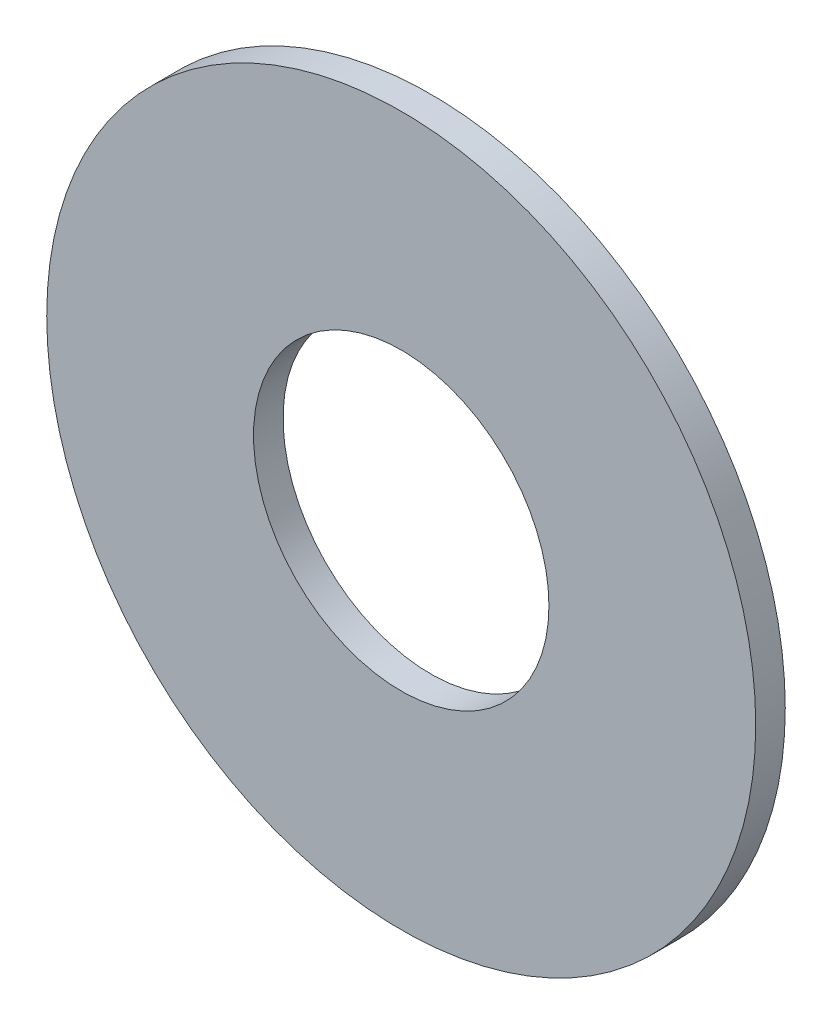
ISO-10303-21;
HEADER;
FILE_DESCRIPTION(('STEP AP214'),'2;1');
FILE_NAME('part.step','',(''),(''),'','','');
FILE_SCHEMA(('AUTOMOTIVE_DESIGN { 1 0 10303 214 1 1 1 1 }'));
ENDSEC;
DATA;
#1=APPLICATION_CONTEXT('core data for automotive mechanical design processes');
#2=APPLICATION_PROTOCOL_DEFINITION('international standard','automotive_design',2000,#1);
#3=PRODUCT_CONTEXT('',#1,'mechanical');
#4=PRODUCT('Part','Part','',(#3));
#5=PRODUCT_RELATED_PRODUCT_CATEGORY('part','',(#4));
#6=PRODUCT_DEFINITION_FORMATION('','',#4);
#7=PRODUCT_DEFINITION_CONTEXT('part definition',#1,'design');
#8=PRODUCT_DEFINITION('design','',#6,#7);
#9=PRODUCT_DEFINITION_SHAPE('','',#8);
#10=(LENGTH_UNIT() NAMED_UNIT(*) SI_UNIT(.MILLI.,.METRE.));
#11=(NAMED_UNIT(*) PLANE_ANGLE_UNIT() SI_UNIT($,.RADIAN.));
#12=(NAMED_UNIT(*) SI_UNIT($,.STERADIAN.) SOLID_ANGLE_UNIT());
#13=UNCERTAINTY_MEASURE_WITH_UNIT(LENGTH_MEASURE(1.E-05),#10,'distance_accuracy_value','');
#14=(GEOMETRIC_REPRESENTATION_CONTEXT(3) GLOBAL_UNCERTAINTY_ASSIGNED_CONTEXT((#13)) GLOBAL_UNIT_ASSIGNED_CONTEXT((#10,
#11,#12)) REPRESENTATION_CONTEXT('',''));
#15=CARTESIAN_POINT('',(0.,0.,0.));
#16=DIRECTION('',(0.,0.,1.));
#17=DIRECTION('',(1.,0.,0.));
#18=AXIS2_PLACEMENT_3D('',#15,#16,#17);
#19=CARTESIAN_POINT('',(0.,0.,0.5));
#20=DIRECTION('',(0.,0.,-1.));
#21=DIRECTION('',(-1.,0.,0.));
#22=AXIS2_PLACEMENT_3D('',#19,#20,#21);
#23=CYLINDRICAL_SURFACE('',#22,6.);
#24=CARTESIAN_POINT('',(0.,0.,0.5));
#25=DIRECTION('',(0.,0.,1.));
#26=DIRECTION('',(1.,0.,0.));
#27=AXIS2_PLACEMENT_3D('',#24,#25,#26);
#28=CIRCLE('',#27,6.);
#29=CARTESIAN_POINT('',(6.,0.,0.5));
#30=VERTEX_POINT('',#29);
#31=EDGE_CURVE('E10',#30,#30,#28,.T.);
#32=ORIENTED_EDGE('',*,*,#31,.F.);
#33=EDGE_LOOP('',(#32));
#34=FACE_BOUND('',#33,.T.);
#35=CARTESIAN_POINT('',(0.,0.,0.));
#36=DIRECTION('',(0.,0.,1.));
#37=DIRECTION('',(1.,0.,0.));
#38=AXIS2_PLACEMENT_3D('',#35,#36,#37);
#39=CIRCLE('',#38,6.);
#40=CARTESIAN_POINT('',(6.,0.,0.));
#41=VERTEX_POINT('',#40);
#42=EDGE_CURVE('E46',#41,#41,#39,.T.);
#43=ORIENTED_EDGE('',*,*,#42,.T.);
#44=EDGE_LOOP('',(#43));
#45=FACE_BOUND('',#44,.T.);
#46=ADVANCED_FACE('F43',(#34,#45),#23,.T.);
#47=CARTESIAN_POINT('',(0.,0.,0.5));
#48=DIRECTION('',(0.,0.,1.));
#49=DIRECTION('',(1.,0.,0.));
#50=AXIS2_PLACEMENT_3D('',#47,#48,#49);
#51=PLANE('',#50);
#52=CARTESIAN_POINT('',(0.,0.,0.5));
#53=DIRECTION('',(0.,0.,1.));
#54=DIRECTION('',(1.,0.,0.));
#55=AXIS2_PLACEMENT_3D('',#52,#53,#54);
#56=CIRCLE('',#55,2.5);
#57=CARTESIAN_POINT('',(2.5,0.,0.5));
#58=VERTEX_POINT('',#57);
#59=EDGE_CURVE('E57',#58,#58,#56,.T.);
#60=ORIENTED_EDGE('',*,*,#59,.F.);
#61=EDGE_LOOP('',(#60));
#62=FACE_BOUND('',#61,.T.);
#63=ORIENTED_EDGE('',*,*,#31,.T.);
#64=EDGE_LOOP('',(#63));
#65=FACE_BOUND('',#64,.T.);
#66=ADVANCED_FACE('F74',(#62,#65),#51,.T.);
#67=CARTESIAN_POINT('',(0.,0.,0.));
#68=DIRECTION('',(0.,0.,1.));
#69=DIRECTION('',(1.,0.,0.));
#70=AXIS2_PLACEMENT_3D('',#67,#68,#69);
#71=PLANE('',#70);
#72=CARTESIAN_POINT('',(0.,0.,0.));
#73=DIRECTION('',(0.,0.,1.));
#74=DIRECTION('',(1.,0.,0.));
#75=AXIS2_PLACEMENT_3D('',#72,#73,#74);
#76=CIRCLE('',#75,2.5);
#77=CARTESIAN_POINT('',(2.5,0.,0.));
#78=VERTEX_POINT('',#77);
#79=EDGE_CURVE('E55',#78,#78,#76,.T.);
#80=ORIENTED_EDGE('',*,*,#79,.T.);
#81=EDGE_LOOP('',(#80));
#82=FACE_BOUND('',#81,.T.);
#83=ORIENTED_EDGE('',*,*,#42,.F.);
#84=EDGE_LOOP('',(#83));
#85=FACE_BOUND('',#84,.T.);
#86=ADVANCED_FACE('F65',(#82,#85),#71,.F.);
#87=CARTESIAN_POINT('',(0.,0.,0.));
#88=DIRECTION('',(0.,0.,1.));
#89=DIRECTION('',(1.,0.,0.));
#90=AXIS2_PLACEMENT_3D('',#87,#88,#89);
#91=CYLINDRICAL_SURFACE('',#90,2.5);
#92=ORIENTED_EDGE('',*,*,#79,.F.);
#93=EDGE_LOOP('',(#92));
#94=FACE_BOUND('',#93,.T.);
#95=ORIENTED_EDGE('',*,*,#59,.T.);
#96=EDGE_LOOP('',(#95));
#97=FACE_BOUND('',#96,.T.);
#98=ADVANCED_FACE('F68',(#94,#97),#91,.F.);
#99=CLOSED_SHELL('',(#46,#66,#86,#98));
#100=MANIFOLD_SOLID_BREP('B2',#99);
#101=ADVANCED_BREP_SHAPE_REPRESENTATION('',(#18,#100),#14);
#102=SHAPE_DEFINITION_REPRESENTATION(#9,#101);
ENDSEC;
END-ISO-10303-21;
